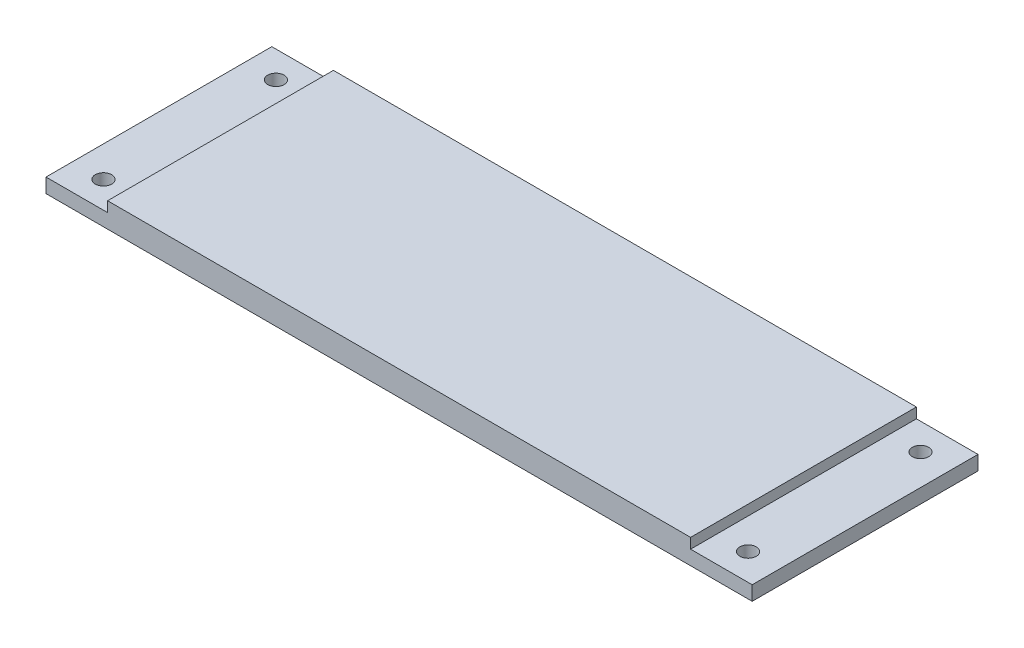
ISO-10303-21;
HEADER;
FILE_DESCRIPTION(('STEP AP214'),'2;1');
FILE_NAME('part.step','',(''),(''),'','','');
FILE_SCHEMA(('AUTOMOTIVE_DESIGN { 1 0 10303 214 1 1 1 1 }'));
ENDSEC;
DATA;
#1=APPLICATION_CONTEXT('core data for automotive mechanical design processes');
#2=APPLICATION_PROTOCOL_DEFINITION('international standard','automotive_design',2000,#1);
#3=PRODUCT_CONTEXT('',#1,'mechanical');
#4=PRODUCT('Part','Part','',(#3));
#5=PRODUCT_RELATED_PRODUCT_CATEGORY('part','',(#4));
#6=PRODUCT_DEFINITION_FORMATION('','',#4);
#7=PRODUCT_DEFINITION_CONTEXT('part definition',#1,'design');
#8=PRODUCT_DEFINITION('design','',#6,#7);
#9=PRODUCT_DEFINITION_SHAPE('','',#8);
#10=(LENGTH_UNIT() NAMED_UNIT(*) SI_UNIT(.MILLI.,.METRE.));
#11=(NAMED_UNIT(*) PLANE_ANGLE_UNIT() SI_UNIT($,.RADIAN.));
#12=(NAMED_UNIT(*) SI_UNIT($,.STERADIAN.) SOLID_ANGLE_UNIT());
#13=UNCERTAINTY_MEASURE_WITH_UNIT(LENGTH_MEASURE(1.E-05),#10,'distance_accuracy_value','');
#14=(GEOMETRIC_REPRESENTATION_CONTEXT(3) GLOBAL_UNCERTAINTY_ASSIGNED_CONTEXT((#13)) GLOBAL_UNIT_ASSIGNED_CONTEXT((#10,
#11,#12)) REPRESENTATION_CONTEXT('',''));
#15=CARTESIAN_POINT('',(0.,0.,0.));
#16=DIRECTION('',(0.,0.,1.));
#17=DIRECTION('',(1.,0.,0.));
#18=AXIS2_PLACEMENT_3D('',#15,#16,#17);
#19=CARTESIAN_POINT('',(0.,3.5,0.));
#20=DIRECTION('',(0.,1.,0.));
#21=DIRECTION('',(0.,0.,1.));
#22=AXIS2_PLACEMENT_3D('',#19,#20,#21);
#23=PLANE('',#22);
#24=DIRECTION('',(0.,0.,1.));
#25=VECTOR('',#24,1.);
#26=CARTESIAN_POINT('',(-71.,3.5,-27.5));
#27=LINE('',#26,#25);
#28=CARTESIAN_POINT('',(-71.,3.5,-27.5));
#29=VERTEX_POINT('',#28);
#30=CARTESIAN_POINT('',(-71.,3.5,27.5));
#31=VERTEX_POINT('',#30);
#32=EDGE_CURVE('E49',#29,#31,#27,.T.);
#33=ORIENTED_EDGE('',*,*,#32,.F.);
#34=DIRECTION('',(-1.,0.,0.));
#35=VECTOR('',#34,1.);
#36=CARTESIAN_POINT('',(-86.,3.5,-27.5));
#37=LINE('',#36,#35);
#38=CARTESIAN_POINT('',(-86.,3.5,-27.5));
#39=VERTEX_POINT('',#38);
#40=EDGE_CURVE('E143',#29,#39,#37,.T.);
#41=ORIENTED_EDGE('',*,*,#40,.T.);
#42=DIRECTION('',(0.,0.,1.));
#43=VECTOR('',#42,1.);
#44=CARTESIAN_POINT('',(-86.,3.5,-27.5));
#45=LINE('',#44,#43);
#46=CARTESIAN_POINT('',(-86.,3.5,27.5));
#47=VERTEX_POINT('',#46);
#48=EDGE_CURVE('E177',#39,#47,#45,.T.);
#49=ORIENTED_EDGE('',*,*,#48,.T.);
#50=DIRECTION('',(1.,0.,0.));
#51=VECTOR('',#50,1.);
#52=CARTESIAN_POINT('',(-86.,3.5,27.5));
#53=LINE('',#52,#51);
#54=EDGE_CURVE('E162',#47,#31,#53,.T.);
#55=ORIENTED_EDGE('',*,*,#54,.T.);
#56=EDGE_LOOP('',(#33,#41,#49,#55));
#57=FACE_BOUND('',#56,.T.);
#58=CARTESIAN_POINT('',(-78.5,3.5,-21.));
#59=DIRECTION('',(0.,1.,0.));
#60=DIRECTION('',(0.,0.,1.));
#61=AXIS2_PLACEMENT_3D('',#58,#59,#60);
#62=CIRCLE('',#61,2.);
#63=CARTESIAN_POINT('',(-78.5,3.5,-19.));
#64=VERTEX_POINT('',#63);
#65=EDGE_CURVE('E189',#64,#64,#62,.T.);
#66=ORIENTED_EDGE('',*,*,#65,.F.);
#67=EDGE_LOOP('',(#66));
#68=FACE_BOUND('',#67,.T.);
#69=CARTESIAN_POINT('',(-78.5,3.5,21.));
#70=DIRECTION('',(0.,1.,0.));
#71=DIRECTION('',(0.,0.,1.));
#72=AXIS2_PLACEMENT_3D('',#69,#70,#71);
#73=CIRCLE('',#72,2.);
#74=CARTESIAN_POINT('',(-78.5,3.5,23.));
#75=VERTEX_POINT('',#74);
#76=EDGE_CURVE('E185',#75,#75,#73,.T.);
#77=ORIENTED_EDGE('',*,*,#76,.F.);
#78=EDGE_LOOP('',(#77));
#79=FACE_BOUND('',#78,.T.);
#80=ADVANCED_FACE('F32',(#57,#68,#79),#23,.T.);
#81=CARTESIAN_POINT('',(-86.,3.5,-27.5));
#82=DIRECTION('',(1.,0.,0.));
#83=DIRECTION('',(0.,0.,-1.));
#84=AXIS2_PLACEMENT_3D('',#81,#82,#83);
#85=PLANE('',#84);
#86=DIRECTION('',(0.,0.,1.));
#87=VECTOR('',#86,1.);
#88=CARTESIAN_POINT('',(-86.,0.,-27.5));
#89=LINE('',#88,#87);
#90=CARTESIAN_POINT('',(-86.,0.,-27.5));
#91=VERTEX_POINT('',#90);
#92=CARTESIAN_POINT('',(-86.,0.,27.5));
#93=VERTEX_POINT('',#92);
#94=EDGE_CURVE('E173',#91,#93,#89,.T.);
#95=ORIENTED_EDGE('',*,*,#94,.T.);
#96=DIRECTION('',(0.,-1.,0.));
#97=VECTOR('',#96,1.);
#98=CARTESIAN_POINT('',(-86.,3.5,27.5));
#99=LINE('',#98,#97);
#100=EDGE_CURVE('E11',#47,#93,#99,.T.);
#101=ORIENTED_EDGE('',*,*,#100,.F.);
#102=ORIENTED_EDGE('',*,*,#48,.F.);
#103=DIRECTION('',(0.,-1.,0.));
#104=VECTOR('',#103,1.);
#105=CARTESIAN_POINT('',(-86.,3.5,-27.5));
#106=LINE('',#105,#104);
#107=EDGE_CURVE('E157',#39,#91,#106,.T.);
#108=ORIENTED_EDGE('',*,*,#107,.T.);
#109=EDGE_LOOP('',(#95,#101,#102,#108));
#110=FACE_BOUND('',#109,.T.);
#111=ADVANCED_FACE('F34',(#110),#85,.F.);
#112=CARTESIAN_POINT('',(-86.,3.5,27.5));
#113=DIRECTION('',(0.,0.,-1.));
#114=DIRECTION('',(-1.,0.,0.));
#115=AXIS2_PLACEMENT_3D('',#112,#113,#114);
#116=PLANE('',#115);
#117=DIRECTION('',(1.,0.,0.));
#118=VECTOR('',#117,1.);
#119=CARTESIAN_POINT('',(-86.,0.,27.5));
#120=LINE('',#119,#118);
#121=CARTESIAN_POINT('',(86.,0.,27.5));
#122=VERTEX_POINT('',#121);
#123=EDGE_CURVE('E202',#93,#122,#120,.T.);
#124=ORIENTED_EDGE('',*,*,#123,.T.);
#125=DIRECTION('',(0.,-1.,0.));
#126=VECTOR('',#125,1.);
#127=CARTESIAN_POINT('',(86.,3.5,27.5));
#128=LINE('',#127,#126);
#129=CARTESIAN_POINT('',(86.,3.5,27.5));
#130=VERTEX_POINT('',#129);
#131=EDGE_CURVE('E41',#130,#122,#128,.T.);
#132=ORIENTED_EDGE('',*,*,#131,.F.);
#133=CARTESIAN_POINT('',(71.,3.5,27.5));
#134=VERTEX_POINT('',#133);
#135=EDGE_CURVE('E166',#134,#130,#53,.T.);
#136=ORIENTED_EDGE('',*,*,#135,.F.);
#137=DIRECTION('',(0.,-1.,0.));
#138=VECTOR('',#137,1.);
#139=CARTESIAN_POINT('',(71.,6.,27.5));
#140=LINE('',#139,#138);
#141=CARTESIAN_POINT('',(71.,6.,27.5));
#142=VERTEX_POINT('',#141);
#143=EDGE_CURVE('E105',#142,#134,#140,.T.);
#144=ORIENTED_EDGE('',*,*,#143,.F.);
#145=DIRECTION('',(1.,0.,0.));
#146=VECTOR('',#145,1.);
#147=CARTESIAN_POINT('',(-71.,6.,27.5));
#148=LINE('',#147,#146);
#149=CARTESIAN_POINT('',(-71.,6.,27.5));
#150=VERTEX_POINT('',#149);
#151=EDGE_CURVE('E99',#150,#142,#148,.T.);
#152=ORIENTED_EDGE('',*,*,#151,.F.);
#153=DIRECTION('',(0.,-1.,0.));
#154=VECTOR('',#153,1.);
#155=CARTESIAN_POINT('',(-71.,6.,27.5));
#156=LINE('',#155,#154);
#157=EDGE_CURVE('E103',#150,#31,#156,.T.);
#158=ORIENTED_EDGE('',*,*,#157,.T.);
#159=ORIENTED_EDGE('',*,*,#54,.F.);
#160=ORIENTED_EDGE('',*,*,#100,.T.);
#161=EDGE_LOOP('',(#124,#132,#136,#144,#152,#158,#159,#160));
#162=FACE_BOUND('',#161,.T.);
#163=ADVANCED_FACE('F101',(#162),#116,.F.);
#164=CARTESIAN_POINT('',(86.,3.5,-27.5));
#165=DIRECTION('',(-1.,0.,0.));
#166=DIRECTION('',(0.,0.,1.));
#167=AXIS2_PLACEMENT_3D('',#164,#165,#166);
#168=PLANE('',#167);
#169=DIRECTION('',(0.,0.,-1.));
#170=VECTOR('',#169,1.);
#171=CARTESIAN_POINT('',(86.,0.,-27.5));
#172=LINE('',#171,#170);
#173=CARTESIAN_POINT('',(86.,0.,-27.5));
#174=VERTEX_POINT('',#173);
#175=EDGE_CURVE('E201',#122,#174,#172,.T.);
#176=ORIENTED_EDGE('',*,*,#175,.T.);
#177=DIRECTION('',(0.,-1.,0.));
#178=VECTOR('',#177,1.);
#179=CARTESIAN_POINT('',(86.,3.5,-27.5));
#180=LINE('',#179,#178);
#181=CARTESIAN_POINT('',(86.,3.5,-27.5));
#182=VERTEX_POINT('',#181);
#183=EDGE_CURVE('E195',#182,#174,#180,.T.);
#184=ORIENTED_EDGE('',*,*,#183,.F.);
#185=DIRECTION('',(0.,0.,-1.));
#186=VECTOR('',#185,1.);
#187=CARTESIAN_POINT('',(86.,3.5,-27.5));
#188=LINE('',#187,#186);
#189=EDGE_CURVE('E161',#130,#182,#188,.T.);
#190=ORIENTED_EDGE('',*,*,#189,.F.);
#191=ORIENTED_EDGE('',*,*,#131,.T.);
#192=EDGE_LOOP('',(#176,#184,#190,#191));
#193=FACE_BOUND('',#192,.T.);
#194=ADVANCED_FACE('F233',(#193),#168,.F.);
#195=CARTESIAN_POINT('',(-86.,3.5,-27.5));
#196=DIRECTION('',(0.,0.,1.));
#197=DIRECTION('',(1.,0.,0.));
#198=AXIS2_PLACEMENT_3D('',#195,#196,#197);
#199=PLANE('',#198);
#200=DIRECTION('',(-1.,0.,0.));
#201=VECTOR('',#200,1.);
#202=CARTESIAN_POINT('',(-86.,0.,-27.5));
#203=LINE('',#202,#201);
#204=EDGE_CURVE('E199',#174,#91,#203,.T.);
#205=ORIENTED_EDGE('',*,*,#204,.T.);
#206=ORIENTED_EDGE('',*,*,#107,.F.);
#207=ORIENTED_EDGE('',*,*,#40,.F.);
#208=DIRECTION('',(0.,-1.,0.));
#209=VECTOR('',#208,1.);
#210=CARTESIAN_POINT('',(-71.,6.,-27.5));
#211=LINE('',#210,#209);
#212=CARTESIAN_POINT('',(-71.,6.,-27.5));
#213=VERTEX_POINT('',#212);
#214=EDGE_CURVE('E133',#213,#29,#211,.T.);
#215=ORIENTED_EDGE('',*,*,#214,.F.);
#216=DIRECTION('',(-1.,0.,0.));
#217=VECTOR('',#216,1.);
#218=CARTESIAN_POINT('',(-71.,6.,-27.5));
#219=LINE('',#218,#217);
#220=CARTESIAN_POINT('',(71.,6.,-27.5));
#221=VERTEX_POINT('',#220);
#222=EDGE_CURVE('E114',#221,#213,#219,.T.);
#223=ORIENTED_EDGE('',*,*,#222,.F.);
#224=DIRECTION('',(0.,-1.,0.));
#225=VECTOR('',#224,1.);
#226=CARTESIAN_POINT('',(71.,6.,-27.5));
#227=LINE('',#226,#225);
#228=CARTESIAN_POINT('',(71.,3.5,-27.5));
#229=VERTEX_POINT('',#228);
#230=EDGE_CURVE('E125',#221,#229,#227,.T.);
#231=ORIENTED_EDGE('',*,*,#230,.T.);
#232=EDGE_CURVE('E160',#182,#229,#37,.T.);
#233=ORIENTED_EDGE('',*,*,#232,.F.);
#234=ORIENTED_EDGE('',*,*,#183,.T.);
#235=EDGE_LOOP('',(#205,#206,#207,#215,#223,#231,#233,#234));
#236=FACE_BOUND('',#235,.T.);
#237=ADVANCED_FACE('F154',(#236),#199,.F.);
#238=DIRECTION('',(0.,0.,-1.));
#239=VECTOR('',#238,1.);
#240=CARTESIAN_POINT('',(71.,3.5,-27.5));
#241=LINE('',#240,#239);
#242=EDGE_CURVE('E57',#134,#229,#241,.T.);
#243=ORIENTED_EDGE('',*,*,#242,.F.);
#244=ORIENTED_EDGE('',*,*,#135,.T.);
#245=ORIENTED_EDGE('',*,*,#189,.T.);
#246=ORIENTED_EDGE('',*,*,#232,.T.);
#247=EDGE_LOOP('',(#243,#244,#245,#246));
#248=FACE_BOUND('',#247,.T.);
#249=CARTESIAN_POINT('',(78.5,3.5,-21.));
#250=DIRECTION('',(0.,1.,0.));
#251=DIRECTION('',(0.,0.,-1.));
#252=AXIS2_PLACEMENT_3D('',#249,#250,#251);
#253=CIRCLE('',#252,2.);
#254=CARTESIAN_POINT('',(78.5,3.5,-23.));
#255=VERTEX_POINT('',#254);
#256=EDGE_CURVE('E120',#255,#255,#253,.T.);
#257=ORIENTED_EDGE('',*,*,#256,.F.);
#258=EDGE_LOOP('',(#257));
#259=FACE_BOUND('',#258,.T.);
#260=CARTESIAN_POINT('',(78.5,3.5,20.9999999999999));
#261=DIRECTION('',(0.,1.,0.));
#262=DIRECTION('',(0.,0.,-1.));
#263=AXIS2_PLACEMENT_3D('',#260,#261,#262);
#264=CIRCLE('',#263,2.);
#265=CARTESIAN_POINT('',(78.5,3.5,18.9999999999999));
#266=VERTEX_POINT('',#265);
#267=EDGE_CURVE('E181',#266,#266,#264,.T.);
#268=ORIENTED_EDGE('',*,*,#267,.F.);
#269=EDGE_LOOP('',(#268));
#270=FACE_BOUND('',#269,.T.);
#271=ADVANCED_FACE('F223',(#248,#259,#270),#23,.T.);
#272=CARTESIAN_POINT('',(0.,0.,0.));
#273=DIRECTION('',(0.,1.,0.));
#274=DIRECTION('',(0.,0.,1.));
#275=AXIS2_PLACEMENT_3D('',#272,#273,#274);
#276=PLANE('',#275);
#277=CARTESIAN_POINT('',(78.5,0.,-21.));
#278=DIRECTION('',(0.,1.,0.));
#279=DIRECTION('',(0.,0.,1.));
#280=AXIS2_PLACEMENT_3D('',#277,#278,#279);
#281=CIRCLE('',#280,2.);
#282=CARTESIAN_POINT('',(78.5,0.,-19.));
#283=VERTEX_POINT('',#282);
#284=EDGE_CURVE('E123',#283,#283,#281,.T.);
#285=ORIENTED_EDGE('',*,*,#284,.T.);
#286=EDGE_LOOP('',(#285));
#287=FACE_BOUND('',#286,.T.);
#288=CARTESIAN_POINT('',(78.5,0.,20.9999999999999));
#289=DIRECTION('',(0.,1.,0.));
#290=DIRECTION('',(0.,0.,1.));
#291=AXIS2_PLACEMENT_3D('',#288,#289,#290);
#292=CIRCLE('',#291,2.);
#293=CARTESIAN_POINT('',(78.5,0.,22.9999999999999));
#294=VERTEX_POINT('',#293);
#295=EDGE_CURVE('E182',#294,#294,#292,.T.);
#296=ORIENTED_EDGE('',*,*,#295,.T.);
#297=EDGE_LOOP('',(#296));
#298=FACE_BOUND('',#297,.T.);
#299=CARTESIAN_POINT('',(-78.5,0.,21.));
#300=DIRECTION('',(0.,1.,0.));
#301=DIRECTION('',(0.,0.,1.));
#302=AXIS2_PLACEMENT_3D('',#299,#300,#301);
#303=CIRCLE('',#302,2.);
#304=CARTESIAN_POINT('',(-78.5,0.,23.));
#305=VERTEX_POINT('',#304);
#306=EDGE_CURVE('E186',#305,#305,#303,.T.);
#307=ORIENTED_EDGE('',*,*,#306,.T.);
#308=EDGE_LOOP('',(#307));
#309=FACE_BOUND('',#308,.T.);
#310=CARTESIAN_POINT('',(-78.5,0.,-21.));
#311=DIRECTION('',(0.,1.,0.));
#312=DIRECTION('',(0.,0.,1.));
#313=AXIS2_PLACEMENT_3D('',#310,#311,#312);
#314=CIRCLE('',#313,2.);
#315=CARTESIAN_POINT('',(-78.5,0.,-19.));
#316=VERTEX_POINT('',#315);
#317=EDGE_CURVE('E190',#316,#316,#314,.T.);
#318=ORIENTED_EDGE('',*,*,#317,.T.);
#319=EDGE_LOOP('',(#318));
#320=FACE_BOUND('',#319,.T.);
#321=ORIENTED_EDGE('',*,*,#94,.F.);
#322=ORIENTED_EDGE('',*,*,#204,.F.);
#323=ORIENTED_EDGE('',*,*,#175,.F.);
#324=ORIENTED_EDGE('',*,*,#123,.F.);
#325=EDGE_LOOP('',(#321,#322,#323,#324));
#326=FACE_BOUND('',#325,.T.);
#327=ADVANCED_FACE('F210',(#287,#298,#309,#320,#326),#276,.F.);
#328=CARTESIAN_POINT('',(-78.5,-2.5,-21.));
#329=DIRECTION('',(0.,1.,0.));
#330=DIRECTION('',(0.,0.,1.));
#331=AXIS2_PLACEMENT_3D('',#328,#329,#330);
#332=CYLINDRICAL_SURFACE('',#331,2.);
#333=ORIENTED_EDGE('',*,*,#65,.T.);
#334=EDGE_LOOP('',(#333));
#335=FACE_BOUND('',#334,.T.);
#336=ORIENTED_EDGE('',*,*,#317,.F.);
#337=EDGE_LOOP('',(#336));
#338=FACE_BOUND('',#337,.T.);
#339=ADVANCED_FACE('F230',(#335,#338),#332,.F.);
#340=CARTESIAN_POINT('',(-78.5,-2.5,21.));
#341=DIRECTION('',(0.,1.,0.));
#342=DIRECTION('',(0.,0.,1.));
#343=AXIS2_PLACEMENT_3D('',#340,#341,#342);
#344=CYLINDRICAL_SURFACE('',#343,2.);
#345=ORIENTED_EDGE('',*,*,#76,.T.);
#346=EDGE_LOOP('',(#345));
#347=FACE_BOUND('',#346,.T.);
#348=ORIENTED_EDGE('',*,*,#306,.F.);
#349=EDGE_LOOP('',(#348));
#350=FACE_BOUND('',#349,.T.);
#351=ADVANCED_FACE('F299',(#347,#350),#344,.F.);
#352=CARTESIAN_POINT('',(78.5,-2.5,20.9999999999999));
#353=DIRECTION('',(0.,1.,0.));
#354=DIRECTION('',(0.,0.,1.));
#355=AXIS2_PLACEMENT_3D('',#352,#353,#354);
#356=CYLINDRICAL_SURFACE('',#355,2.);
#357=ORIENTED_EDGE('',*,*,#267,.T.);
#358=EDGE_LOOP('',(#357));
#359=FACE_BOUND('',#358,.T.);
#360=ORIENTED_EDGE('',*,*,#295,.F.);
#361=EDGE_LOOP('',(#360));
#362=FACE_BOUND('',#361,.T.);
#363=ADVANCED_FACE('F220',(#359,#362),#356,.F.);
#364=CARTESIAN_POINT('',(78.5,-2.5,-21.));
#365=DIRECTION('',(0.,1.,0.));
#366=DIRECTION('',(0.,0.,1.));
#367=AXIS2_PLACEMENT_3D('',#364,#365,#366);
#368=CYLINDRICAL_SURFACE('',#367,2.);
#369=ORIENTED_EDGE('',*,*,#256,.T.);
#370=EDGE_LOOP('',(#369));
#371=FACE_BOUND('',#370,.T.);
#372=ORIENTED_EDGE('',*,*,#284,.F.);
#373=EDGE_LOOP('',(#372));
#374=FACE_BOUND('',#373,.T.);
#375=ADVANCED_FACE('F273',(#371,#374),#368,.F.);
#376=CARTESIAN_POINT('',(-71.,6.,-27.5));
#377=DIRECTION('',(1.,0.,0.));
#378=DIRECTION('',(0.,0.,-1.));
#379=AXIS2_PLACEMENT_3D('',#376,#377,#378);
#380=PLANE('',#379);
#381=ORIENTED_EDGE('',*,*,#32,.T.);
#382=ORIENTED_EDGE('',*,*,#157,.F.);
#383=DIRECTION('',(0.,0.,1.));
#384=VECTOR('',#383,1.);
#385=CARTESIAN_POINT('',(-71.,6.,-27.5));
#386=LINE('',#385,#384);
#387=EDGE_CURVE('E109',#213,#150,#386,.T.);
#388=ORIENTED_EDGE('',*,*,#387,.F.);
#389=ORIENTED_EDGE('',*,*,#214,.T.);
#390=EDGE_LOOP('',(#381,#382,#388,#389));
#391=FACE_BOUND('',#390,.T.);
#392=ADVANCED_FACE('F119',(#391),#380,.F.);
#393=CARTESIAN_POINT('',(71.,6.,-27.5));
#394=DIRECTION('',(-1.,0.,0.));
#395=DIRECTION('',(0.,0.,1.));
#396=AXIS2_PLACEMENT_3D('',#393,#394,#395);
#397=PLANE('',#396);
#398=ORIENTED_EDGE('',*,*,#242,.T.);
#399=ORIENTED_EDGE('',*,*,#230,.F.);
#400=DIRECTION('',(0.,0.,-1.));
#401=VECTOR('',#400,1.);
#402=CARTESIAN_POINT('',(71.,6.,-27.5));
#403=LINE('',#402,#401);
#404=EDGE_CURVE('E108',#142,#221,#403,.T.);
#405=ORIENTED_EDGE('',*,*,#404,.F.);
#406=ORIENTED_EDGE('',*,*,#143,.T.);
#407=EDGE_LOOP('',(#398,#399,#405,#406));
#408=FACE_BOUND('',#407,.T.);
#409=ADVANCED_FACE('F153',(#408),#397,.F.);
#410=CARTESIAN_POINT('',(0.,6.,0.));
#411=DIRECTION('',(0.,1.,0.));
#412=DIRECTION('',(0.,0.,1.));
#413=AXIS2_PLACEMENT_3D('',#410,#411,#412);
#414=PLANE('',#413);
#415=ORIENTED_EDGE('',*,*,#387,.T.);
#416=ORIENTED_EDGE('',*,*,#151,.T.);
#417=ORIENTED_EDGE('',*,*,#404,.T.);
#418=ORIENTED_EDGE('',*,*,#222,.T.);
#419=EDGE_LOOP('',(#415,#416,#417,#418));
#420=FACE_BOUND('',#419,.T.);
#421=ADVANCED_FACE('F112',(#420),#414,.T.);
#422=CLOSED_SHELL('',(#80,#111,#163,#194,#237,#271,#327,#339,#351,#363,#375,#392,#409,#421));
#423=MANIFOLD_SOLID_BREP('B2',#422);
#424=ADVANCED_BREP_SHAPE_REPRESENTATION('',(#18,#423),#14);
#425=SHAPE_DEFINITION_REPRESENTATION(#9,#424);
ENDSEC;
END-ISO-10303-21;
